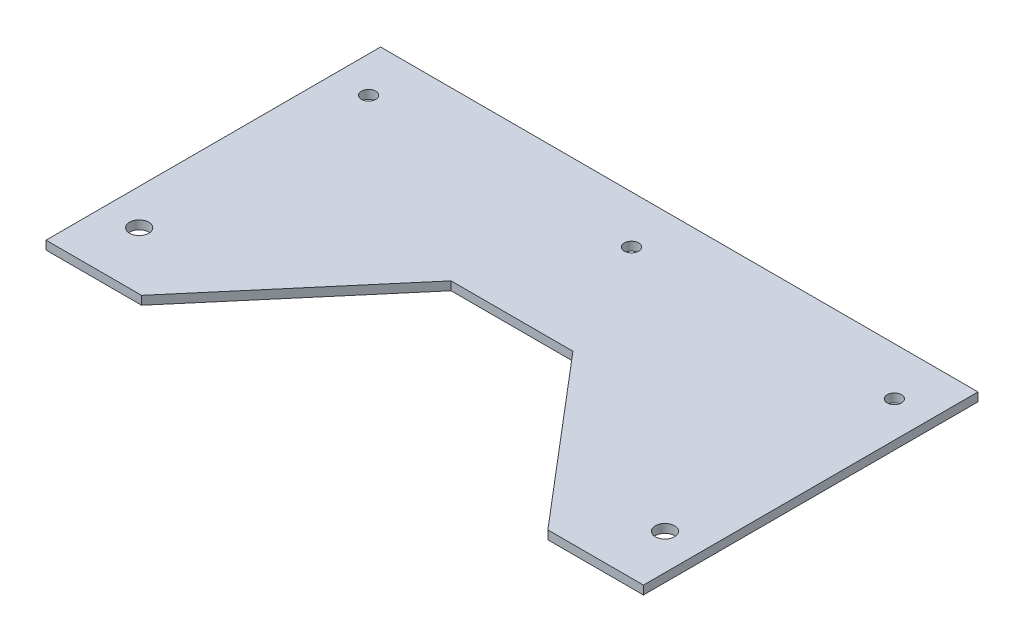
ISO-10303-21;
HEADER;
FILE_DESCRIPTION(('STEP AP214'),'2;1');
FILE_NAME('part.step','',(''),(''),'','','');
FILE_SCHEMA(('AUTOMOTIVE_DESIGN { 1 0 10303 214 1 1 1 1 }'));
ENDSEC;
DATA;
#1=APPLICATION_CONTEXT('core data for automotive mechanical design processes');
#2=APPLICATION_PROTOCOL_DEFINITION('international standard','automotive_design',2000,#1);
#3=PRODUCT_CONTEXT('',#1,'mechanical');
#4=PRODUCT('Part','Part','',(#3));
#5=PRODUCT_RELATED_PRODUCT_CATEGORY('part','',(#4));
#6=PRODUCT_DEFINITION_FORMATION('','',#4);
#7=PRODUCT_DEFINITION_CONTEXT('part definition',#1,'design');
#8=PRODUCT_DEFINITION('design','',#6,#7);
#9=PRODUCT_DEFINITION_SHAPE('','',#8);
#10=(LENGTH_UNIT() NAMED_UNIT(*) SI_UNIT(.MILLI.,.METRE.));
#11=(NAMED_UNIT(*) PLANE_ANGLE_UNIT() SI_UNIT($,.RADIAN.));
#12=(NAMED_UNIT(*) SI_UNIT($,.STERADIAN.) SOLID_ANGLE_UNIT());
#13=UNCERTAINTY_MEASURE_WITH_UNIT(LENGTH_MEASURE(1.E-05),#10,'distance_accuracy_value','');
#14=(GEOMETRIC_REPRESENTATION_CONTEXT(3) GLOBAL_UNCERTAINTY_ASSIGNED_CONTEXT((#13)) GLOBAL_UNIT_ASSIGNED_CONTEXT((#10,
#11,#12)) REPRESENTATION_CONTEXT('',''));
#15=CARTESIAN_POINT('',(0.,0.,0.));
#16=DIRECTION('',(0.,0.,1.));
#17=DIRECTION('',(1.,0.,0.));
#18=AXIS2_PLACEMENT_3D('',#15,#16,#17);
#19=CARTESIAN_POINT('',(-19.6281332130389,1.143,16.683913231083));
#20=DIRECTION('',(-0.761939317759459,0.,0.647648420095541));
#21=DIRECTION('',(0.647648420095541,0.,0.761939317759459));
#22=AXIS2_PLACEMENT_3D('',#19,#20,#21);
#23=PLANE('',#22);
#24=DIRECTION('',(0.,1.,0.));
#25=VECTOR('',#24,1.);
#26=CARTESIAN_POINT('',(-29.773490990991,1.143,4.74819819819819));
#27=LINE('',#26,#25);
#28=CARTESIAN_POINT('',(-29.773490990991,-1.143,4.74819819819819));
#29=VERTEX_POINT('',#28);
#30=CARTESIAN_POINT('',(-29.773490990991,1.143,4.74819819819819));
#31=VERTEX_POINT('',#30);
#32=EDGE_CURVE('E110',#29,#31,#27,.T.);
#33=ORIENTED_EDGE('',*,*,#32,.F.);
#34=DIRECTION('',(-0.647648420095541,0.,-0.761939317759459));
#35=VECTOR('',#34,1.);
#36=CARTESIAN_POINT('',(-19.6281332130389,-1.143,16.683913231083));
#37=LINE('',#36,#35);
#38=CARTESIAN_POINT('',(8.00900900900902,-1.143,49.1981981981982));
#39=VERTEX_POINT('',#38);
#40=EDGE_CURVE('E176',#39,#29,#37,.T.);
#41=ORIENTED_EDGE('',*,*,#40,.F.);
#42=DIRECTION('',(0.,-1.,0.));
#43=VECTOR('',#42,1.);
#44=CARTESIAN_POINT('',(8.00900900900902,1.143,49.1981981981982));
#45=LINE('',#44,#43);
#46=CARTESIAN_POINT('',(8.00900900900902,1.143,49.1981981981982));
#47=VERTEX_POINT('',#46);
#48=EDGE_CURVE('E46',#47,#39,#45,.T.);
#49=ORIENTED_EDGE('',*,*,#48,.F.);
#50=DIRECTION('',(-0.647648420095541,0.,-0.761939317759459));
#51=VECTOR('',#50,1.);
#52=CARTESIAN_POINT('',(-19.6281332130389,1.143,16.683913231083));
#53=LINE('',#52,#51);
#54=EDGE_CURVE('E162',#47,#31,#53,.T.);
#55=ORIENTED_EDGE('',*,*,#54,.T.);
#56=EDGE_LOOP('',(#33,#41,#49,#55));
#57=FACE_BOUND('',#56,.T.);
#58=ADVANCED_FACE('F37',(#57),#23,.T.);
#59=CARTESIAN_POINT('',(0.,1.143,49.1981981981982));
#60=DIRECTION('',(0.,0.,1.));
#61=DIRECTION('',(1.,0.,0.));
#62=AXIS2_PLACEMENT_3D('',#59,#60,#61);
#63=PLANE('',#62);
#64=DIRECTION('',(-1.,0.,0.));
#65=VECTOR('',#64,1.);
#66=CARTESIAN_POINT('',(0.,-1.143,49.1981981981982));
#67=LINE('',#66,#65);
#68=CARTESIAN_POINT('',(33.409009009009,-1.143,49.1981981981982));
#69=VERTEX_POINT('',#68);
#70=EDGE_CURVE('E179',#69,#39,#67,.T.);
#71=ORIENTED_EDGE('',*,*,#70,.F.);
#72=DIRECTION('',(0.,-1.,0.));
#73=VECTOR('',#72,1.);
#74=CARTESIAN_POINT('',(33.409009009009,1.143,49.1981981981982));
#75=LINE('',#74,#73);
#76=CARTESIAN_POINT('',(33.409009009009,1.143,49.1981981981982));
#77=VERTEX_POINT('',#76);
#78=EDGE_CURVE('E66',#77,#69,#75,.T.);
#79=ORIENTED_EDGE('',*,*,#78,.F.);
#80=DIRECTION('',(-1.,0.,0.));
#81=VECTOR('',#80,1.);
#82=CARTESIAN_POINT('',(0.,1.143,49.1981981981982));
#83=LINE('',#82,#81);
#84=EDGE_CURVE('E164',#77,#47,#83,.T.);
#85=ORIENTED_EDGE('',*,*,#84,.T.);
#86=ORIENTED_EDGE('',*,*,#48,.T.);
#87=EDGE_LOOP('',(#71,#79,#85,#86));
#88=FACE_BOUND('',#87,.T.);
#89=ADVANCED_FACE('F189',(#88),#63,.T.);
#90=CARTESIAN_POINT('',(33.409009009009,1.143,0.));
#91=DIRECTION('',(1.,0.,0.));
#92=DIRECTION('',(0.,0.,-1.));
#93=AXIS2_PLACEMENT_3D('',#90,#91,#92);
#94=PLANE('',#93);
#95=DIRECTION('',(0.,0.,1.));
#96=VECTOR('',#95,1.);
#97=CARTESIAN_POINT('',(33.409009009009,-1.143,0.));
#98=LINE('',#97,#96);
#99=CARTESIAN_POINT('',(33.409009009009,-1.143,-39.7018018018018));
#100=VERTEX_POINT('',#99);
#101=EDGE_CURVE('E182',#100,#69,#98,.T.);
#102=ORIENTED_EDGE('',*,*,#101,.F.);
#103=DIRECTION('',(0.,-1.,0.));
#104=VECTOR('',#103,1.);
#105=CARTESIAN_POINT('',(33.409009009009,1.143,-39.7018018018018));
#106=LINE('',#105,#104);
#107=CARTESIAN_POINT('',(33.409009009009,1.143,-39.7018018018018));
#108=VERTEX_POINT('',#107);
#109=EDGE_CURVE('E54',#108,#100,#106,.T.);
#110=ORIENTED_EDGE('',*,*,#109,.F.);
#111=DIRECTION('',(0.,0.,1.));
#112=VECTOR('',#111,1.);
#113=CARTESIAN_POINT('',(33.409009009009,1.143,0.));
#114=LINE('',#113,#112);
#115=EDGE_CURVE('E167',#108,#77,#114,.T.);
#116=ORIENTED_EDGE('',*,*,#115,.T.);
#117=ORIENTED_EDGE('',*,*,#78,.T.);
#118=EDGE_LOOP('',(#102,#110,#116,#117));
#119=FACE_BOUND('',#118,.T.);
#120=ADVANCED_FACE('F195',(#119),#94,.T.);
#121=CARTESIAN_POINT('',(23.884009009009,1.143,33.9581981981982));
#122=DIRECTION('',(0.,-1.,0.));
#123=DIRECTION('',(0.,0.,-1.));
#124=AXIS2_PLACEMENT_3D('',#121,#122,#123);
#125=CYLINDRICAL_SURFACE('',#124,2.5527);
#126=CARTESIAN_POINT('',(23.884009009009,1.143,33.9581981981982));
#127=DIRECTION('',(0.,1.,0.));
#128=DIRECTION('',(0.,0.,1.));
#129=AXIS2_PLACEMENT_3D('',#126,#127,#128);
#130=CIRCLE('',#129,2.5527);
#131=CARTESIAN_POINT('',(23.884009009009,1.143,36.5108981981982));
#132=VERTEX_POINT('',#131);
#133=EDGE_CURVE('E158',#132,#132,#130,.T.);
#134=ORIENTED_EDGE('',*,*,#133,.T.);
#135=EDGE_LOOP('',(#134));
#136=FACE_BOUND('',#135,.T.);
#137=CARTESIAN_POINT('',(23.884009009009,-1.143,33.9581981981982));
#138=DIRECTION('',(0.,1.,0.));
#139=DIRECTION('',(0.,0.,1.));
#140=AXIS2_PLACEMENT_3D('',#137,#138,#139);
#141=CIRCLE('',#140,2.5527);
#142=CARTESIAN_POINT('',(23.884009009009,-1.143,36.5108981981982));
#143=VERTEX_POINT('',#142);
#144=EDGE_CURVE('E173',#143,#143,#141,.T.);
#145=ORIENTED_EDGE('',*,*,#144,.F.);
#146=EDGE_LOOP('',(#145));
#147=FACE_BOUND('',#146,.T.);
#148=ADVANCED_FACE('F197',(#136,#147),#125,.F.);
#149=CARTESIAN_POINT('',(23.884009009009,1.143,-27.0018018018018));
#150=DIRECTION('',(0.,-1.,0.));
#151=DIRECTION('',(0.,0.,-1.));
#152=AXIS2_PLACEMENT_3D('',#149,#150,#151);
#153=CYLINDRICAL_SURFACE('',#152,1.905);
#154=CARTESIAN_POINT('',(23.884009009009,1.143,-27.0018018018018));
#155=DIRECTION('',(0.,1.,0.));
#156=DIRECTION('',(0.,0.,1.));
#157=AXIS2_PLACEMENT_3D('',#154,#155,#156);
#158=CIRCLE('',#157,1.905);
#159=CARTESIAN_POINT('',(23.884009009009,1.143,-25.0968018018018));
#160=VERTEX_POINT('',#159);
#161=EDGE_CURVE('E155',#160,#160,#158,.T.);
#162=ORIENTED_EDGE('',*,*,#161,.T.);
#163=EDGE_LOOP('',(#162));
#164=FACE_BOUND('',#163,.T.);
#165=CARTESIAN_POINT('',(23.884009009009,-1.143,-27.0018018018018));
#166=DIRECTION('',(0.,1.,0.));
#167=DIRECTION('',(0.,0.,1.));
#168=AXIS2_PLACEMENT_3D('',#165,#166,#167);
#169=CIRCLE('',#168,1.905);
#170=CARTESIAN_POINT('',(23.884009009009,-1.143,-25.0968018018018));
#171=VERTEX_POINT('',#170);
#172=EDGE_CURVE('E154',#171,#171,#169,.T.);
#173=ORIENTED_EDGE('',*,*,#172,.F.);
#174=EDGE_LOOP('',(#173));
#175=FACE_BOUND('',#174,.T.);
#176=ADVANCED_FACE('F39',(#164,#175),#153,.F.);
#177=CARTESIAN_POINT('',(0.,1.143,-39.7018018018018));
#178=DIRECTION('',(0.,0.,-1.));
#179=DIRECTION('',(-1.,0.,0.));
#180=AXIS2_PLACEMENT_3D('',#177,#178,#179);
#181=PLANE('',#180);
#182=DIRECTION('',(1.,0.,0.));
#183=VECTOR('',#182,1.);
#184=CARTESIAN_POINT('',(0.,-1.143,-39.7018018018018));
#185=LINE('',#184,#183);
#186=CARTESIAN_POINT('',(-125.340990990991,-1.143,-39.7018018018018));
#187=VERTEX_POINT('',#186);
#188=EDGE_CURVE('E159',#187,#100,#185,.T.);
#189=ORIENTED_EDGE('',*,*,#188,.F.);
#190=DIRECTION('',(0.,-1.,0.));
#191=VECTOR('',#190,1.);
#192=CARTESIAN_POINT('',(-125.340990990991,1.143,-39.7018018018018));
#193=LINE('',#192,#191);
#194=CARTESIAN_POINT('',(-125.340990990991,1.143,-39.7018018018018));
#195=VERTEX_POINT('',#194);
#196=EDGE_CURVE('E151',#195,#187,#193,.T.);
#197=ORIENTED_EDGE('',*,*,#196,.F.);
#198=DIRECTION('',(1.,0.,0.));
#199=VECTOR('',#198,1.);
#200=CARTESIAN_POINT('',(0.,1.143,-39.7018018018018));
#201=LINE('',#200,#199);
#202=EDGE_CURVE('E169',#195,#108,#201,.T.);
#203=ORIENTED_EDGE('',*,*,#202,.T.);
#204=ORIENTED_EDGE('',*,*,#109,.T.);
#205=EDGE_LOOP('',(#189,#197,#203,#204));
#206=FACE_BOUND('',#205,.T.);
#207=ADVANCED_FACE('F235',(#206),#181,.T.);
#208=CARTESIAN_POINT('',(0.,1.143,0.));
#209=DIRECTION('',(0.,1.,0.));
#210=DIRECTION('',(0.,0.,1.));
#211=AXIS2_PLACEMENT_3D('',#208,#209,#210);
#212=PLANE('',#211);
#213=DIRECTION('',(1.,0.,0.));
#214=VECTOR('',#213,1.);
#215=CARTESIAN_POINT('',(-71.365990990991,1.143,4.74819819819819));
#216=LINE('',#215,#214);
#217=CARTESIAN_POINT('',(-62.158490990991,1.143,4.74819819819819));
#218=VERTEX_POINT('',#217);
#219=EDGE_CURVE('E106',#218,#31,#216,.T.);
#220=ORIENTED_EDGE('',*,*,#219,.T.);
#221=ORIENTED_EDGE('',*,*,#54,.F.);
#222=ORIENTED_EDGE('',*,*,#84,.F.);
#223=ORIENTED_EDGE('',*,*,#115,.F.);
#224=ORIENTED_EDGE('',*,*,#202,.F.);
#225=DIRECTION('',(0.,0.,1.));
#226=VECTOR('',#225,1.);
#227=CARTESIAN_POINT('',(-125.340990990991,1.143,0.));
#228=LINE('',#227,#226);
#229=CARTESIAN_POINT('',(-125.340990990991,1.143,49.1981981981982));
#230=VERTEX_POINT('',#229);
#231=EDGE_CURVE('E132',#195,#230,#228,.T.);
#232=ORIENTED_EDGE('',*,*,#231,.T.);
#233=DIRECTION('',(1.,0.,0.));
#234=VECTOR('',#233,1.);
#235=CARTESIAN_POINT('',(-91.931981981982,1.143,49.1981981981982));
#236=LINE('',#235,#234);
#237=CARTESIAN_POINT('',(-99.940990990991,1.143,49.1981981981982));
#238=VERTEX_POINT('',#237);
#239=EDGE_CURVE('E126',#230,#238,#236,.T.);
#240=ORIENTED_EDGE('',*,*,#239,.T.);
#241=DIRECTION('',(0.647648420095541,0.,-0.761939317759459));
#242=VECTOR('',#241,1.);
#243=CARTESIAN_POINT('',(-72.3038487689431,1.143,16.683913231083));
#244=LINE('',#243,#242);
#245=EDGE_CURVE('E120',#238,#218,#244,.T.);
#246=ORIENTED_EDGE('',*,*,#245,.T.);
#247=EDGE_LOOP('',(#220,#221,#222,#223,#224,#232,#240,#246));
#248=FACE_BOUND('',#247,.T.);
#249=CARTESIAN_POINT('',(-45.965990990991,1.143,-27.0018018018018));
#250=DIRECTION('',(0.,1.,0.));
#251=DIRECTION('',(0.,0.,1.));
#252=AXIS2_PLACEMENT_3D('',#249,#250,#251);
#253=CIRCLE('',#252,1.905);
#254=CARTESIAN_POINT('',(-45.965990990991,1.143,-25.0968018018018));
#255=VERTEX_POINT('',#254);
#256=EDGE_CURVE('E358',#255,#255,#253,.T.);
#257=ORIENTED_EDGE('',*,*,#256,.F.);
#258=EDGE_LOOP('',(#257));
#259=FACE_BOUND('',#258,.T.);
#260=ORIENTED_EDGE('',*,*,#161,.F.);
#261=EDGE_LOOP('',(#260));
#262=FACE_BOUND('',#261,.T.);
#263=ORIENTED_EDGE('',*,*,#133,.F.);
#264=EDGE_LOOP('',(#263));
#265=FACE_BOUND('',#264,.T.);
#266=CARTESIAN_POINT('',(-115.815990990991,1.143,-27.0018018018018));
#267=DIRECTION('',(0.,-1.,0.));
#268=DIRECTION('',(0.,0.,1.));
#269=AXIS2_PLACEMENT_3D('',#266,#267,#268);
#270=CIRCLE('',#269,1.905);
#271=CARTESIAN_POINT('',(-115.815990990991,1.143,-25.0968018018018));
#272=VERTEX_POINT('',#271);
#273=EDGE_CURVE('E147',#272,#272,#270,.T.);
#274=ORIENTED_EDGE('',*,*,#273,.T.);
#275=EDGE_LOOP('',(#274));
#276=FACE_BOUND('',#275,.T.);
#277=CARTESIAN_POINT('',(-115.815990990991,1.143,33.9581981981982));
#278=DIRECTION('',(0.,-1.,0.));
#279=DIRECTION('',(0.,0.,1.));
#280=AXIS2_PLACEMENT_3D('',#277,#278,#279);
#281=CIRCLE('',#280,2.5527);
#282=CARTESIAN_POINT('',(-115.815990990991,1.143,36.5108981981982));
#283=VERTEX_POINT('',#282);
#284=EDGE_CURVE('E365',#283,#283,#281,.T.);
#285=ORIENTED_EDGE('',*,*,#284,.T.);
#286=EDGE_LOOP('',(#285));
#287=FACE_BOUND('',#286,.T.);
#288=ADVANCED_FACE('F123',(#248,#259,#262,#265,#276,#287),#212,.T.);
#289=CARTESIAN_POINT('',(0.,-1.143,0.));
#290=DIRECTION('',(0.,1.,0.));
#291=DIRECTION('',(0.,0.,1.));
#292=AXIS2_PLACEMENT_3D('',#289,#290,#291);
#293=PLANE('',#292);
#294=ORIENTED_EDGE('',*,*,#40,.T.);
#295=DIRECTION('',(1.,0.,0.));
#296=VECTOR('',#295,1.);
#297=CARTESIAN_POINT('',(-71.365990990991,-1.143,4.74819819819819));
#298=LINE('',#297,#296);
#299=CARTESIAN_POINT('',(-62.158490990991,-1.143,4.74819819819819));
#300=VERTEX_POINT('',#299);
#301=EDGE_CURVE('E113',#300,#29,#298,.T.);
#302=ORIENTED_EDGE('',*,*,#301,.F.);
#303=DIRECTION('',(0.647648420095541,0.,-0.761939317759459));
#304=VECTOR('',#303,1.);
#305=CARTESIAN_POINT('',(-72.3038487689431,-1.143,16.683913231083));
#306=LINE('',#305,#304);
#307=CARTESIAN_POINT('',(-99.940990990991,-1.143,49.1981981981982));
#308=VERTEX_POINT('',#307);
#309=EDGE_CURVE('E122',#308,#300,#306,.T.);
#310=ORIENTED_EDGE('',*,*,#309,.F.);
#311=DIRECTION('',(1.,0.,0.));
#312=VECTOR('',#311,1.);
#313=CARTESIAN_POINT('',(-91.931981981982,-1.143,49.1981981981982));
#314=LINE('',#313,#312);
#315=CARTESIAN_POINT('',(-125.340990990991,-1.143,49.1981981981982));
#316=VERTEX_POINT('',#315);
#317=EDGE_CURVE('E145',#316,#308,#314,.T.);
#318=ORIENTED_EDGE('',*,*,#317,.F.);
#319=DIRECTION('',(0.,0.,1.));
#320=VECTOR('',#319,1.);
#321=CARTESIAN_POINT('',(-125.340990990991,-1.143,0.));
#322=LINE('',#321,#320);
#323=EDGE_CURVE('E143',#187,#316,#322,.T.);
#324=ORIENTED_EDGE('',*,*,#323,.F.);
#325=ORIENTED_EDGE('',*,*,#188,.T.);
#326=ORIENTED_EDGE('',*,*,#101,.T.);
#327=ORIENTED_EDGE('',*,*,#70,.T.);
#328=EDGE_LOOP('',(#294,#302,#310,#318,#324,#325,#326,#327));
#329=FACE_BOUND('',#328,.T.);
#330=CARTESIAN_POINT('',(-45.965990990991,-1.143,-27.0018018018018));
#331=DIRECTION('',(0.,1.,0.));
#332=DIRECTION('',(0.,0.,1.));
#333=AXIS2_PLACEMENT_3D('',#330,#331,#332);
#334=CIRCLE('',#333,1.905);
#335=CARTESIAN_POINT('',(-45.965990990991,-1.143,-25.0968018018018));
#336=VERTEX_POINT('',#335);
#337=EDGE_CURVE('E140',#336,#336,#334,.T.);
#338=ORIENTED_EDGE('',*,*,#337,.T.);
#339=EDGE_LOOP('',(#338));
#340=FACE_BOUND('',#339,.T.);
#341=ORIENTED_EDGE('',*,*,#172,.T.);
#342=EDGE_LOOP('',(#341));
#343=FACE_BOUND('',#342,.T.);
#344=ORIENTED_EDGE('',*,*,#144,.T.);
#345=EDGE_LOOP('',(#344));
#346=FACE_BOUND('',#345,.T.);
#347=CARTESIAN_POINT('',(-115.815990990991,-1.143,-27.0018018018018));
#348=DIRECTION('',(0.,-1.,0.));
#349=DIRECTION('',(0.,0.,1.));
#350=AXIS2_PLACEMENT_3D('',#347,#348,#349);
#351=CIRCLE('',#350,1.905);
#352=CARTESIAN_POINT('',(-115.815990990991,-1.143,-25.0968018018018));
#353=VERTEX_POINT('',#352);
#354=EDGE_CURVE('E136',#353,#353,#351,.T.);
#355=ORIENTED_EDGE('',*,*,#354,.F.);
#356=EDGE_LOOP('',(#355));
#357=FACE_BOUND('',#356,.T.);
#358=CARTESIAN_POINT('',(-115.815990990991,-1.143,33.9581981981982));
#359=DIRECTION('',(0.,-1.,0.));
#360=DIRECTION('',(0.,0.,1.));
#361=AXIS2_PLACEMENT_3D('',#358,#359,#360);
#362=CIRCLE('',#361,2.5527);
#363=CARTESIAN_POINT('',(-115.815990990991,-1.143,36.5108981981982));
#364=VERTEX_POINT('',#363);
#365=EDGE_CURVE('E139',#364,#364,#362,.T.);
#366=ORIENTED_EDGE('',*,*,#365,.F.);
#367=EDGE_LOOP('',(#366));
#368=FACE_BOUND('',#367,.T.);
#369=ADVANCED_FACE('F192',(#329,#340,#343,#346,#357,#368),#293,.F.);
#370=CARTESIAN_POINT('',(-125.340990990991,1.143,0.));
#371=DIRECTION('',(1.,0.,0.));
#372=DIRECTION('',(0.,0.,-1.));
#373=AXIS2_PLACEMENT_3D('',#370,#371,#372);
#374=PLANE('',#373);
#375=ORIENTED_EDGE('',*,*,#323,.T.);
#376=DIRECTION('',(0.,-1.,0.));
#377=VECTOR('',#376,1.);
#378=CARTESIAN_POINT('',(-125.340990990991,1.143,49.1981981981982));
#379=LINE('',#378,#377);
#380=EDGE_CURVE('E130',#230,#316,#379,.T.);
#381=ORIENTED_EDGE('',*,*,#380,.F.);
#382=ORIENTED_EDGE('',*,*,#231,.F.);
#383=ORIENTED_EDGE('',*,*,#196,.T.);
#384=EDGE_LOOP('',(#375,#381,#382,#383));
#385=FACE_BOUND('',#384,.T.);
#386=ADVANCED_FACE('F251',(#385),#374,.F.);
#387=CARTESIAN_POINT('',(-91.931981981982,1.143,49.1981981981982));
#388=DIRECTION('',(0.,0.,-1.));
#389=DIRECTION('',(-1.,0.,0.));
#390=AXIS2_PLACEMENT_3D('',#387,#388,#389);
#391=PLANE('',#390);
#392=ORIENTED_EDGE('',*,*,#317,.T.);
#393=DIRECTION('',(0.,-1.,0.));
#394=VECTOR('',#393,1.);
#395=CARTESIAN_POINT('',(-99.940990990991,1.143,49.1981981981982));
#396=LINE('',#395,#394);
#397=EDGE_CURVE('E128',#238,#308,#396,.T.);
#398=ORIENTED_EDGE('',*,*,#397,.F.);
#399=ORIENTED_EDGE('',*,*,#239,.F.);
#400=ORIENTED_EDGE('',*,*,#380,.T.);
#401=EDGE_LOOP('',(#392,#398,#399,#400));
#402=FACE_BOUND('',#401,.T.);
#403=ADVANCED_FACE('F256',(#402),#391,.F.);
#404=CARTESIAN_POINT('',(-115.815990990991,1.143,33.9581981981982));
#405=DIRECTION('',(0.,-1.,0.));
#406=DIRECTION('',(0.,0.,-1.));
#407=AXIS2_PLACEMENT_3D('',#404,#405,#406);
#408=CYLINDRICAL_SURFACE('',#407,2.5527);
#409=ORIENTED_EDGE('',*,*,#284,.F.);
#410=EDGE_LOOP('',(#409));
#411=FACE_BOUND('',#410,.T.);
#412=ORIENTED_EDGE('',*,*,#365,.T.);
#413=EDGE_LOOP('',(#412));
#414=FACE_BOUND('',#413,.T.);
#415=ADVANCED_FACE('F268',(#411,#414),#408,.F.);
#416=CARTESIAN_POINT('',(-115.815990990991,1.143,-27.0018018018018));
#417=DIRECTION('',(0.,-1.,0.));
#418=DIRECTION('',(0.,0.,-1.));
#419=AXIS2_PLACEMENT_3D('',#416,#417,#418);
#420=CYLINDRICAL_SURFACE('',#419,1.905);
#421=ORIENTED_EDGE('',*,*,#273,.F.);
#422=EDGE_LOOP('',(#421));
#423=FACE_BOUND('',#422,.T.);
#424=ORIENTED_EDGE('',*,*,#354,.T.);
#425=EDGE_LOOP('',(#424));
#426=FACE_BOUND('',#425,.T.);
#427=ADVANCED_FACE('F278',(#423,#426),#420,.F.);
#428=CARTESIAN_POINT('',(-72.3038487689431,1.143,16.683913231083));
#429=DIRECTION('',(-0.761939317759459,0.,-0.647648420095541));
#430=DIRECTION('',(-0.647648420095541,0.,0.761939317759459));
#431=AXIS2_PLACEMENT_3D('',#428,#429,#430);
#432=PLANE('',#431);
#433=ORIENTED_EDGE('',*,*,#309,.T.);
#434=DIRECTION('',(0.,1.,0.));
#435=VECTOR('',#434,1.);
#436=CARTESIAN_POINT('',(-62.158490990991,1.143,4.74819819819819));
#437=LINE('',#436,#435);
#438=EDGE_CURVE('E11',#300,#218,#437,.T.);
#439=ORIENTED_EDGE('',*,*,#438,.T.);
#440=ORIENTED_EDGE('',*,*,#245,.F.);
#441=ORIENTED_EDGE('',*,*,#397,.T.);
#442=EDGE_LOOP('',(#433,#439,#440,#441));
#443=FACE_BOUND('',#442,.T.);
#444=ADVANCED_FACE('F118',(#443),#432,.F.);
#445=CARTESIAN_POINT('',(-45.965990990991,-1.143,-27.0018018018018));
#446=DIRECTION('',(0.,1.,0.));
#447=DIRECTION('',(0.,0.,1.));
#448=AXIS2_PLACEMENT_3D('',#445,#446,#447);
#449=CYLINDRICAL_SURFACE('',#448,1.905);
#450=ORIENTED_EDGE('',*,*,#337,.F.);
#451=EDGE_LOOP('',(#450));
#452=FACE_BOUND('',#451,.T.);
#453=ORIENTED_EDGE('',*,*,#256,.T.);
#454=EDGE_LOOP('',(#453));
#455=FACE_BOUND('',#454,.T.);
#456=ADVANCED_FACE('F294',(#452,#455),#449,.F.);
#457=CARTESIAN_POINT('',(-71.365990990991,-1.143,4.74819819819819));
#458=DIRECTION('',(0.,0.,1.));
#459=DIRECTION('',(1.,0.,0.));
#460=AXIS2_PLACEMENT_3D('',#457,#458,#459);
#461=PLANE('',#460);
#462=ORIENTED_EDGE('',*,*,#301,.T.);
#463=ORIENTED_EDGE('',*,*,#32,.T.);
#464=ORIENTED_EDGE('',*,*,#219,.F.);
#465=ORIENTED_EDGE('',*,*,#438,.F.);
#466=EDGE_LOOP('',(#462,#463,#464,#465));
#467=FACE_BOUND('',#466,.T.);
#468=ADVANCED_FACE('F107',(#467),#461,.T.);
#469=CLOSED_SHELL('',(#58,#89,#120,#148,#176,#207,#288,#369,#386,#403,#415,#427,#444,#456,#468));
#470=MANIFOLD_SOLID_BREP('B2',#469);
#471=ADVANCED_BREP_SHAPE_REPRESENTATION('',(#18,#470),#14);
#472=SHAPE_DEFINITION_REPRESENTATION(#9,#471);
ENDSEC;
END-ISO-10303-21;
